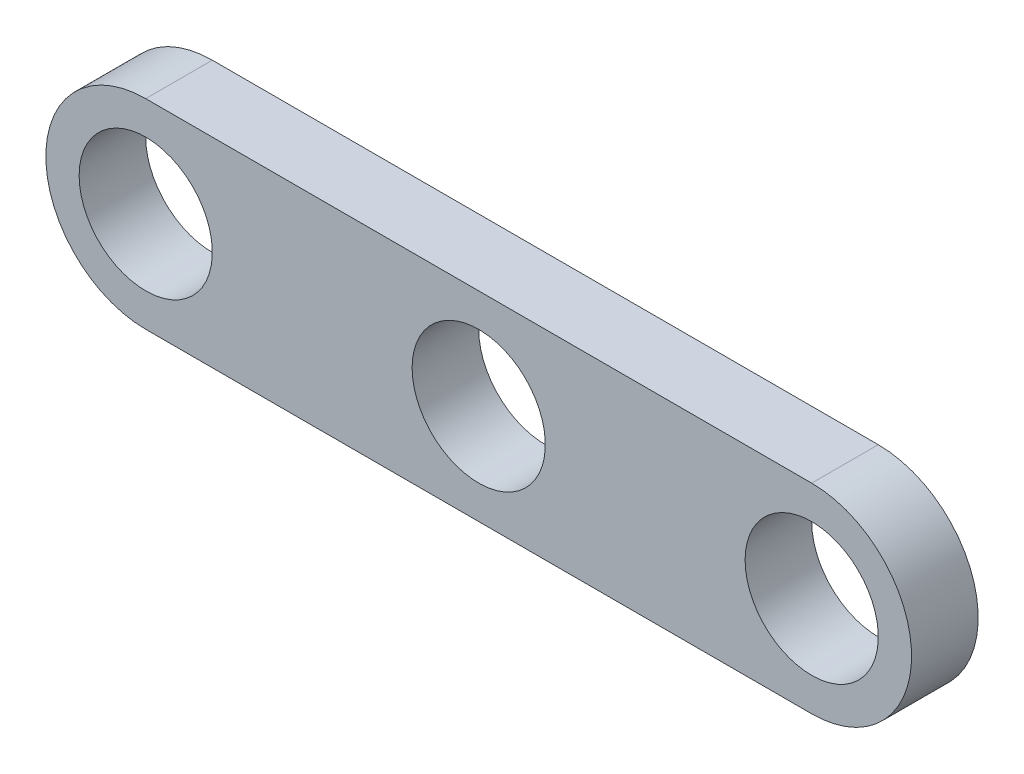
ISO-10303-21;
HEADER;
FILE_DESCRIPTION(('STEP AP214'),'2;1');
FILE_NAME('part.step','',(''),(''),'','','');
FILE_SCHEMA(('AUTOMOTIVE_DESIGN { 1 0 10303 214 1 1 1 1 }'));
ENDSEC;
DATA;
#1=APPLICATION_CONTEXT('core data for automotive mechanical design processes');
#2=APPLICATION_PROTOCOL_DEFINITION('international standard','automotive_design',2000,#1);
#3=PRODUCT_CONTEXT('',#1,'mechanical');
#4=PRODUCT('Part','Part','',(#3));
#5=PRODUCT_RELATED_PRODUCT_CATEGORY('part','',(#4));
#6=PRODUCT_DEFINITION_FORMATION('','',#4);
#7=PRODUCT_DEFINITION_CONTEXT('part definition',#1,'design');
#8=PRODUCT_DEFINITION('design','',#6,#7);
#9=PRODUCT_DEFINITION_SHAPE('','',#8);
#10=(LENGTH_UNIT() NAMED_UNIT(*) SI_UNIT(.MILLI.,.METRE.));
#11=(NAMED_UNIT(*) PLANE_ANGLE_UNIT() SI_UNIT($,.RADIAN.));
#12=(NAMED_UNIT(*) SI_UNIT($,.STERADIAN.) SOLID_ANGLE_UNIT());
#13=UNCERTAINTY_MEASURE_WITH_UNIT(LENGTH_MEASURE(1.E-05),#10,'distance_accuracy_value','');
#14=(GEOMETRIC_REPRESENTATION_CONTEXT(3) GLOBAL_UNCERTAINTY_ASSIGNED_CONTEXT((#13)) GLOBAL_UNIT_ASSIGNED_CONTEXT((#10,
#11,#12)) REPRESENTATION_CONTEXT('',''));
#15=CARTESIAN_POINT('',(0.,0.,0.));
#16=DIRECTION('',(0.,0.,1.));
#17=DIRECTION('',(1.,0.,0.));
#18=AXIS2_PLACEMENT_3D('',#15,#16,#17);
#19=CARTESIAN_POINT('',(0.,30.,10.));
#20=DIRECTION('',(0.,-1.,0.));
#21=DIRECTION('',(1.,0.,0.));
#22=AXIS2_PLACEMENT_3D('',#19,#20,#21);
#23=PLANE('',#22);
#24=DIRECTION('',(-1.,0.,0.));
#25=VECTOR('',#24,1.);
#26=CARTESIAN_POINT('',(0.,30.,0.));
#27=LINE('',#26,#25);
#28=CARTESIAN_POINT('',(0.,30.,0.));
#29=VERTEX_POINT('',#28);
#30=CARTESIAN_POINT('',(-100.,30.,0.));
#31=VERTEX_POINT('',#30);
#32=EDGE_CURVE('E106',#29,#31,#27,.T.);
#33=ORIENTED_EDGE('',*,*,#32,.T.);
#34=DIRECTION('',(0.,0.,-1.));
#35=VECTOR('',#34,1.);
#36=CARTESIAN_POINT('',(-100.,30.,10.));
#37=LINE('',#36,#35);
#38=CARTESIAN_POINT('',(-100.,30.,10.));
#39=VERTEX_POINT('',#38);
#40=EDGE_CURVE('E11',#39,#31,#37,.T.);
#41=ORIENTED_EDGE('',*,*,#40,.F.);
#42=DIRECTION('',(-1.,0.,0.));
#43=VECTOR('',#42,1.);
#44=CARTESIAN_POINT('',(0.,30.,10.));
#45=LINE('',#44,#43);
#46=CARTESIAN_POINT('',(0.,30.,10.));
#47=VERTEX_POINT('',#46);
#48=EDGE_CURVE('E87',#47,#39,#45,.T.);
#49=ORIENTED_EDGE('',*,*,#48,.F.);
#50=DIRECTION('',(0.,0.,-1.));
#51=VECTOR('',#50,1.);
#52=CARTESIAN_POINT('',(0.,30.,10.));
#53=LINE('',#52,#51);
#54=EDGE_CURVE('E102',#47,#29,#53,.T.);
#55=ORIENTED_EDGE('',*,*,#54,.T.);
#56=EDGE_LOOP('',(#33,#41,#49,#55));
#57=FACE_BOUND('',#56,.T.);
#58=ADVANCED_FACE('F39',(#57),#23,.F.);
#59=CARTESIAN_POINT('',(-100.,15.,10.));
#60=DIRECTION('',(0.,0.,-1.));
#61=DIRECTION('',(-1.,0.,0.));
#62=AXIS2_PLACEMENT_3D('',#59,#60,#61);
#63=CYLINDRICAL_SURFACE('',#62,15.);
#64=CARTESIAN_POINT('',(-100.,15.,0.));
#65=DIRECTION('',(0.,0.,1.));
#66=DIRECTION('',(1.,0.,0.));
#67=AXIS2_PLACEMENT_3D('',#64,#65,#66);
#68=CIRCLE('',#67,15.);
#69=CARTESIAN_POINT('',(-100.,0.,0.));
#70=VERTEX_POINT('',#69);
#71=EDGE_CURVE('E93',#31,#70,#68,.T.);
#72=ORIENTED_EDGE('',*,*,#71,.T.);
#73=DIRECTION('',(0.,0.,-1.));
#74=VECTOR('',#73,1.);
#75=CARTESIAN_POINT('',(-100.,0.,10.));
#76=LINE('',#75,#74);
#77=CARTESIAN_POINT('',(-100.,0.,10.));
#78=VERTEX_POINT('',#77);
#79=EDGE_CURVE('E48',#78,#70,#76,.T.);
#80=ORIENTED_EDGE('',*,*,#79,.F.);
#81=CARTESIAN_POINT('',(-100.,15.,10.));
#82=DIRECTION('',(0.,0.,1.));
#83=DIRECTION('',(1.,0.,0.));
#84=AXIS2_PLACEMENT_3D('',#81,#82,#83);
#85=CIRCLE('',#84,15.);
#86=EDGE_CURVE('E82',#39,#78,#85,.T.);
#87=ORIENTED_EDGE('',*,*,#86,.F.);
#88=ORIENTED_EDGE('',*,*,#40,.T.);
#89=EDGE_LOOP('',(#72,#80,#87,#88));
#90=FACE_BOUND('',#89,.T.);
#91=ADVANCED_FACE('F92',(#90),#63,.T.);
#92=CARTESIAN_POINT('',(0.,0.,10.));
#93=DIRECTION('',(0.,-1.,0.));
#94=DIRECTION('',(0.,0.,-1.));
#95=AXIS2_PLACEMENT_3D('',#92,#93,#94);
#96=PLANE('',#95);
#97=DIRECTION('',(-1.,0.,0.));
#98=VECTOR('',#97,1.);
#99=CARTESIAN_POINT('',(0.,0.,0.));
#100=LINE('',#99,#98);
#101=CARTESIAN_POINT('',(0.,0.,0.));
#102=VERTEX_POINT('',#101);
#103=EDGE_CURVE('E113',#102,#70,#100,.T.);
#104=ORIENTED_EDGE('',*,*,#103,.F.);
#105=DIRECTION('',(0.,0.,-1.));
#106=VECTOR('',#105,1.);
#107=CARTESIAN_POINT('',(0.,0.,10.));
#108=LINE('',#107,#106);
#109=CARTESIAN_POINT('',(0.,0.,10.));
#110=VERTEX_POINT('',#109);
#111=EDGE_CURVE('E72',#110,#102,#108,.T.);
#112=ORIENTED_EDGE('',*,*,#111,.F.);
#113=DIRECTION('',(-1.,0.,0.));
#114=VECTOR('',#113,1.);
#115=CARTESIAN_POINT('',(0.,0.,10.));
#116=LINE('',#115,#114);
#117=EDGE_CURVE('E85',#110,#78,#116,.T.);
#118=ORIENTED_EDGE('',*,*,#117,.T.);
#119=ORIENTED_EDGE('',*,*,#79,.T.);
#120=EDGE_LOOP('',(#104,#112,#118,#119));
#121=FACE_BOUND('',#120,.T.);
#122=ADVANCED_FACE('F98',(#121),#96,.T.);
#123=CARTESIAN_POINT('',(0.,15.,10.));
#124=DIRECTION('',(0.,0.,-1.));
#125=DIRECTION('',(-1.,0.,0.));
#126=AXIS2_PLACEMENT_3D('',#123,#124,#125);
#127=CYLINDRICAL_SURFACE('',#126,15.);
#128=CARTESIAN_POINT('',(0.,15.,0.));
#129=DIRECTION('',(0.,0.,1.));
#130=DIRECTION('',(1.,0.,0.));
#131=AXIS2_PLACEMENT_3D('',#128,#129,#130);
#132=CIRCLE('',#131,15.);
#133=EDGE_CURVE('E75',#102,#29,#132,.T.);
#134=ORIENTED_EDGE('',*,*,#133,.T.);
#135=ORIENTED_EDGE('',*,*,#54,.F.);
#136=CARTESIAN_POINT('',(0.,15.,10.));
#137=DIRECTION('',(0.,0.,1.));
#138=DIRECTION('',(1.,0.,0.));
#139=AXIS2_PLACEMENT_3D('',#136,#137,#138);
#140=CIRCLE('',#139,15.);
#141=EDGE_CURVE('E56',#110,#47,#140,.T.);
#142=ORIENTED_EDGE('',*,*,#141,.F.);
#143=ORIENTED_EDGE('',*,*,#111,.T.);
#144=EDGE_LOOP('',(#134,#135,#142,#143));
#145=FACE_BOUND('',#144,.T.);
#146=ADVANCED_FACE('F136',(#145),#127,.T.);
#147=CARTESIAN_POINT('',(-100.,15.,10.));
#148=DIRECTION('',(0.,0.,1.));
#149=DIRECTION('',(1.,0.,0.));
#150=AXIS2_PLACEMENT_3D('',#147,#148,#149);
#151=PLANE('',#150);
#152=CARTESIAN_POINT('',(-50.,15.,10.));
#153=DIRECTION('',(0.,0.,-1.));
#154=DIRECTION('',(-1.,0.,0.));
#155=AXIS2_PLACEMENT_3D('',#152,#153,#154);
#156=CIRCLE('',#155,9.99999999999999);
#157=CARTESIAN_POINT('',(-60.,15.,10.));
#158=VERTEX_POINT('',#157);
#159=EDGE_CURVE('E211',#158,#158,#156,.T.);
#160=ORIENTED_EDGE('',*,*,#159,.T.);
#161=EDGE_LOOP('',(#160));
#162=FACE_BOUND('',#161,.T.);
#163=CARTESIAN_POINT('',(0.,15.,10.));
#164=DIRECTION('',(0.,0.,-1.));
#165=DIRECTION('',(-1.,0.,0.));
#166=AXIS2_PLACEMENT_3D('',#163,#164,#165);
#167=CIRCLE('',#166,10.);
#168=CARTESIAN_POINT('',(-10.,15.,10.));
#169=VERTEX_POINT('',#168);
#170=EDGE_CURVE('E110',#169,#169,#167,.T.);
#171=ORIENTED_EDGE('',*,*,#170,.T.);
#172=EDGE_LOOP('',(#171));
#173=FACE_BOUND('',#172,.T.);
#174=CARTESIAN_POINT('',(-100.,15.,10.));
#175=DIRECTION('',(0.,0.,-1.));
#176=DIRECTION('',(-1.,0.,0.));
#177=AXIS2_PLACEMENT_3D('',#174,#175,#176);
#178=CIRCLE('',#177,9.99999999999999);
#179=CARTESIAN_POINT('',(-110.,15.,10.));
#180=VERTEX_POINT('',#179);
#181=EDGE_CURVE('E199',#180,#180,#178,.T.);
#182=ORIENTED_EDGE('',*,*,#181,.T.);
#183=EDGE_LOOP('',(#182));
#184=FACE_BOUND('',#183,.T.);
#185=ORIENTED_EDGE('',*,*,#48,.T.);
#186=ORIENTED_EDGE('',*,*,#86,.T.);
#187=ORIENTED_EDGE('',*,*,#117,.F.);
#188=ORIENTED_EDGE('',*,*,#141,.T.);
#189=EDGE_LOOP('',(#185,#186,#187,#188));
#190=FACE_BOUND('',#189,.T.);
#191=ADVANCED_FACE('F83',(#162,#173,#184,#190),#151,.T.);
#192=CARTESIAN_POINT('',(-100.,15.,0.));
#193=DIRECTION('',(0.,0.,1.));
#194=DIRECTION('',(1.,0.,0.));
#195=AXIS2_PLACEMENT_3D('',#192,#193,#194);
#196=PLANE('',#195);
#197=CARTESIAN_POINT('',(-50.,15.,0.));
#198=DIRECTION('',(0.,0.,-1.));
#199=DIRECTION('',(-1.,0.,0.));
#200=AXIS2_PLACEMENT_3D('',#197,#198,#199);
#201=CIRCLE('',#200,9.99999999999999);
#202=CARTESIAN_POINT('',(-60.,15.,0.));
#203=VERTEX_POINT('',#202);
#204=EDGE_CURVE('E217',#203,#203,#201,.T.);
#205=ORIENTED_EDGE('',*,*,#204,.F.);
#206=EDGE_LOOP('',(#205));
#207=FACE_BOUND('',#206,.T.);
#208=CARTESIAN_POINT('',(0.,15.,0.));
#209=DIRECTION('',(0.,0.,-1.));
#210=DIRECTION('',(-1.,0.,0.));
#211=AXIS2_PLACEMENT_3D('',#208,#209,#210);
#212=CIRCLE('',#211,10.);
#213=CARTESIAN_POINT('',(-10.,15.,0.));
#214=VERTEX_POINT('',#213);
#215=EDGE_CURVE('E197',#214,#214,#212,.T.);
#216=ORIENTED_EDGE('',*,*,#215,.F.);
#217=EDGE_LOOP('',(#216));
#218=FACE_BOUND('',#217,.T.);
#219=CARTESIAN_POINT('',(-100.,15.,0.));
#220=DIRECTION('',(0.,0.,-1.));
#221=DIRECTION('',(-1.,0.,0.));
#222=AXIS2_PLACEMENT_3D('',#219,#220,#221);
#223=CIRCLE('',#222,9.99999999999999);
#224=CARTESIAN_POINT('',(-110.,15.,0.));
#225=VERTEX_POINT('',#224);
#226=EDGE_CURVE('E205',#225,#225,#223,.T.);
#227=ORIENTED_EDGE('',*,*,#226,.F.);
#228=EDGE_LOOP('',(#227));
#229=FACE_BOUND('',#228,.T.);
#230=ORIENTED_EDGE('',*,*,#32,.F.);
#231=ORIENTED_EDGE('',*,*,#133,.F.);
#232=ORIENTED_EDGE('',*,*,#103,.T.);
#233=ORIENTED_EDGE('',*,*,#71,.F.);
#234=EDGE_LOOP('',(#230,#231,#232,#233));
#235=FACE_BOUND('',#234,.T.);
#236=ADVANCED_FACE('F124',(#207,#218,#229,#235),#196,.F.);
#237=CARTESIAN_POINT('',(-100.,15.,10.));
#238=DIRECTION('',(0.,0.,-1.));
#239=DIRECTION('',(-1.,0.,0.));
#240=AXIS2_PLACEMENT_3D('',#237,#238,#239);
#241=CYLINDRICAL_SURFACE('',#240,9.99999999999999);
#242=ORIENTED_EDGE('',*,*,#181,.F.);
#243=EDGE_LOOP('',(#242));
#244=FACE_BOUND('',#243,.T.);
#245=ORIENTED_EDGE('',*,*,#226,.T.);
#246=EDGE_LOOP('',(#245));
#247=FACE_BOUND('',#246,.T.);
#248=ADVANCED_FACE('F126',(#244,#247),#241,.F.);
#249=CARTESIAN_POINT('',(0.,15.,10.));
#250=DIRECTION('',(0.,0.,-1.));
#251=DIRECTION('',(-1.,0.,0.));
#252=AXIS2_PLACEMENT_3D('',#249,#250,#251);
#253=CYLINDRICAL_SURFACE('',#252,10.);
#254=ORIENTED_EDGE('',*,*,#170,.F.);
#255=EDGE_LOOP('',(#254));
#256=FACE_BOUND('',#255,.T.);
#257=ORIENTED_EDGE('',*,*,#215,.T.);
#258=EDGE_LOOP('',(#257));
#259=FACE_BOUND('',#258,.T.);
#260=ADVANCED_FACE('F133',(#256,#259),#253,.F.);
#261=CARTESIAN_POINT('',(-50.,15.,10.));
#262=DIRECTION('',(0.,0.,-1.));
#263=DIRECTION('',(-1.,0.,0.));
#264=AXIS2_PLACEMENT_3D('',#261,#262,#263);
#265=CYLINDRICAL_SURFACE('',#264,9.99999999999999);
#266=ORIENTED_EDGE('',*,*,#159,.F.);
#267=EDGE_LOOP('',(#266));
#268=FACE_BOUND('',#267,.T.);
#269=ORIENTED_EDGE('',*,*,#204,.T.);
#270=EDGE_LOOP('',(#269));
#271=FACE_BOUND('',#270,.T.);
#272=ADVANCED_FACE('F174',(#268,#271),#265,.F.);
#273=CLOSED_SHELL('',(#58,#91,#122,#146,#191,#236,#248,#260,#272));
#274=MANIFOLD_SOLID_BREP('B2',#273);
#275=ADVANCED_BREP_SHAPE_REPRESENTATION('',(#18,#274),#14);
#276=SHAPE_DEFINITION_REPRESENTATION(#9,#275);
ENDSEC;
END-ISO-10303-21;
